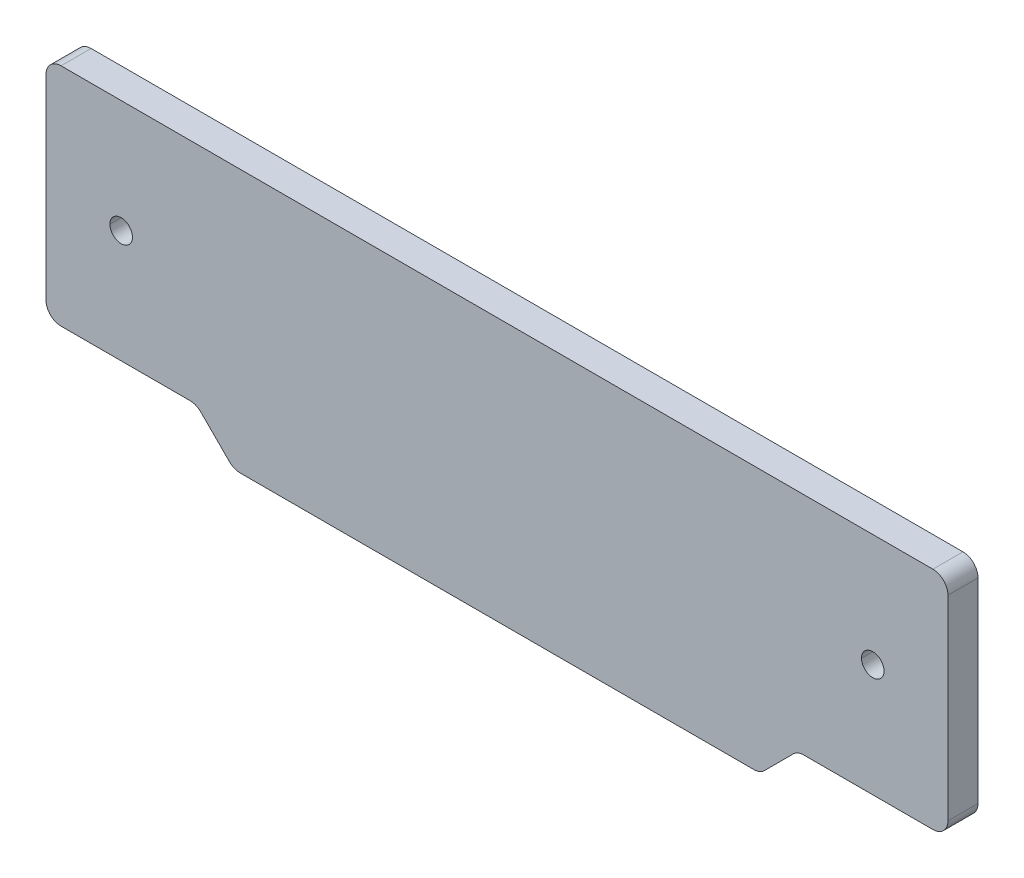
ISO-10303-21;
HEADER;
FILE_DESCRIPTION(('STEP AP214'),'2;1');
FILE_NAME('part.step','',(''),(''),'','','');
FILE_SCHEMA(('AUTOMOTIVE_DESIGN { 1 0 10303 214 1 1 1 1 }'));
ENDSEC;
DATA;
#1=APPLICATION_CONTEXT('core data for automotive mechanical design processes');
#2=APPLICATION_PROTOCOL_DEFINITION('international standard','automotive_design',2000,#1);
#3=PRODUCT_CONTEXT('',#1,'mechanical');
#4=PRODUCT('Part','Part','',(#3));
#5=PRODUCT_RELATED_PRODUCT_CATEGORY('part','',(#4));
#6=PRODUCT_DEFINITION_FORMATION('','',#4);
#7=PRODUCT_DEFINITION_CONTEXT('part definition',#1,'design');
#8=PRODUCT_DEFINITION('design','',#6,#7);
#9=PRODUCT_DEFINITION_SHAPE('','',#8);
#10=(LENGTH_UNIT() NAMED_UNIT(*) SI_UNIT(.MILLI.,.METRE.));
#11=(NAMED_UNIT(*) PLANE_ANGLE_UNIT() SI_UNIT($,.RADIAN.));
#12=(NAMED_UNIT(*) SI_UNIT($,.STERADIAN.) SOLID_ANGLE_UNIT());
#13=UNCERTAINTY_MEASURE_WITH_UNIT(LENGTH_MEASURE(1.E-05),#10,'distance_accuracy_value','');
#14=(GEOMETRIC_REPRESENTATION_CONTEXT(3) GLOBAL_UNCERTAINTY_ASSIGNED_CONTEXT((#13)) GLOBAL_UNIT_ASSIGNED_CONTEXT((#10,
#11,#12)) REPRESENTATION_CONTEXT('',''));
#15=CARTESIAN_POINT('',(0.,0.,0.));
#16=DIRECTION('',(0.,0.,1.));
#17=DIRECTION('',(1.,0.,0.));
#18=AXIS2_PLACEMENT_3D('',#15,#16,#17);
#19=CARTESIAN_POINT('',(34.1715728752538,-16.5010003298521,-1.97999998554587));
#20=DIRECTION('',(0.,0.,1.));
#21=DIRECTION('',(1.,0.,0.));
#22=AXIS2_PLACEMENT_3D('',#19,#20,#21);
#23=CYLINDRICAL_SURFACE('',#22,2.);
#24=CARTESIAN_POINT('',(34.1715728752538,-16.5010003298521,-1.97999998554587));
#25=DIRECTION('',(0.,0.,-1.));
#26=DIRECTION('',(1.,0.,0.));
#27=AXIS2_PLACEMENT_3D('',#24,#25,#26);
#28=CIRCLE('',#27,2.);
#29=CARTESIAN_POINT('',(35.5857864376269,-17.9152138922252,-1.97999998554587));
#30=VERTEX_POINT('',#29);
#31=CARTESIAN_POINT('',(34.1715728752538,-18.5010003298521,-1.97999998554587));
#32=VERTEX_POINT('',#31);
#33=EDGE_CURVE('E260',#30,#32,#28,.T.);
#34=ORIENTED_EDGE('',*,*,#33,.F.);
#35=DIRECTION('',(0.,0.,-1.));
#36=VECTOR('',#35,1.);
#37=CARTESIAN_POINT('',(35.5857864376269,-17.9152138922252,-1.97999998554587));
#38=LINE('',#37,#36);
#39=CARTESIAN_POINT('',(35.5857864376269,-17.9152138922252,2.02000001445413));
#40=VERTEX_POINT('',#39);
#41=EDGE_CURVE('E272',#40,#30,#38,.T.);
#42=ORIENTED_EDGE('',*,*,#41,.F.);
#43=CARTESIAN_POINT('',(34.1715728752538,-16.5010003298521,2.02000001445413));
#44=DIRECTION('',(0.,0.,1.));
#45=DIRECTION('',(1.,0.,0.));
#46=AXIS2_PLACEMENT_3D('',#43,#44,#45);
#47=CIRCLE('',#46,2.);
#48=CARTESIAN_POINT('',(34.1715728752538,-18.5010003298521,2.02000001445413));
#49=VERTEX_POINT('',#48);
#50=EDGE_CURVE('E276',#49,#40,#47,.T.);
#51=ORIENTED_EDGE('',*,*,#50,.F.);
#52=DIRECTION('',(0.,0.,1.));
#53=VECTOR('',#52,1.);
#54=CARTESIAN_POINT('',(34.1715728752538,-18.5010003298521,-1.97999998554587));
#55=LINE('',#54,#53);
#56=EDGE_CURVE('E214',#32,#49,#55,.T.);
#57=ORIENTED_EDGE('',*,*,#56,.F.);
#58=EDGE_LOOP('',(#34,#42,#51,#57));
#59=FACE_BOUND('',#58,.T.);
#60=ADVANCED_FACE('F15',(#59),#23,.T.);
#61=CARTESIAN_POINT('',(40.8284271247462,-15.5010003298521,-1.97999998554587));
#62=DIRECTION('',(0.,0.,-1.));
#63=DIRECTION('',(-1.,0.,0.));
#64=AXIS2_PLACEMENT_3D('',#61,#62,#63);
#65=CYLINDRICAL_SURFACE('',#64,2.);
#66=CARTESIAN_POINT('',(40.8284271247462,-15.5010003298521,-1.97999998554587));
#67=DIRECTION('',(0.,0.,1.));
#68=DIRECTION('',(1.,0.,0.));
#69=AXIS2_PLACEMENT_3D('',#66,#67,#68);
#70=CIRCLE('',#69,2.);
#71=CARTESIAN_POINT('',(40.8284271247462,-13.5010003298521,-1.97999998554587));
#72=VERTEX_POINT('',#71);
#73=CARTESIAN_POINT('',(39.4142135623731,-14.086786767479,-1.97999998554587));
#74=VERTEX_POINT('',#73);
#75=EDGE_CURVE('E257',#72,#74,#70,.T.);
#76=ORIENTED_EDGE('',*,*,#75,.F.);
#77=DIRECTION('',(0.,0.,-1.));
#78=VECTOR('',#77,1.);
#79=CARTESIAN_POINT('',(40.8284271247462,-13.5010003298521,-1.97999998554587));
#80=LINE('',#79,#78);
#81=CARTESIAN_POINT('',(40.8284271247462,-13.5010003298521,2.02000001445413));
#82=VERTEX_POINT('',#81);
#83=EDGE_CURVE('E248',#82,#72,#80,.T.);
#84=ORIENTED_EDGE('',*,*,#83,.F.);
#85=CARTESIAN_POINT('',(40.8284271247462,-15.5010003298521,2.02000001445413));
#86=DIRECTION('',(0.,0.,-1.));
#87=DIRECTION('',(1.,0.,0.));
#88=AXIS2_PLACEMENT_3D('',#85,#86,#87);
#89=CIRCLE('',#88,2.);
#90=CARTESIAN_POINT('',(39.4142135623731,-14.086786767479,2.02000001445413));
#91=VERTEX_POINT('',#90);
#92=EDGE_CURVE('E273',#91,#82,#89,.T.);
#93=ORIENTED_EDGE('',*,*,#92,.F.);
#94=DIRECTION('',(0.,0.,1.));
#95=VECTOR('',#94,1.);
#96=CARTESIAN_POINT('',(39.4142135623731,-14.086786767479,2.02000001445413));
#97=LINE('',#96,#95);
#98=EDGE_CURVE('E371',#74,#91,#97,.T.);
#99=ORIENTED_EDGE('',*,*,#98,.F.);
#100=EDGE_LOOP('',(#76,#84,#93,#99));
#101=FACE_BOUND('',#100,.T.);
#102=ADVANCED_FACE('F447',(#101),#65,.F.);
#103=CARTESIAN_POINT('',(-34.1715728752538,-16.5010003298521,-1.97999998554587));
#104=DIRECTION('',(0.,0.,1.));
#105=DIRECTION('',(1.,0.,0.));
#106=AXIS2_PLACEMENT_3D('',#103,#104,#105);
#107=CYLINDRICAL_SURFACE('',#106,2.);
#108=CARTESIAN_POINT('',(-34.1715728752538,-16.5010003298521,-1.97999998554587));
#109=DIRECTION('',(0.,0.,-1.));
#110=DIRECTION('',(1.,0.,0.));
#111=AXIS2_PLACEMENT_3D('',#108,#109,#110);
#112=CIRCLE('',#111,2.);
#113=CARTESIAN_POINT('',(-34.1715728752538,-18.5010003298521,-1.97999998554587));
#114=VERTEX_POINT('',#113);
#115=CARTESIAN_POINT('',(-35.5857864376269,-17.9152138922252,-1.97999998554587));
#116=VERTEX_POINT('',#115);
#117=EDGE_CURVE('E19',#114,#116,#112,.T.);
#118=ORIENTED_EDGE('',*,*,#117,.F.);
#119=DIRECTION('',(0.,0.,-1.));
#120=VECTOR('',#119,1.);
#121=CARTESIAN_POINT('',(-34.1715728752538,-18.5010003298521,-1.97999998554587));
#122=LINE('',#121,#120);
#123=CARTESIAN_POINT('',(-34.1715728752538,-18.5010003298521,2.02000001445413));
#124=VERTEX_POINT('',#123);
#125=EDGE_CURVE('E229',#124,#114,#122,.T.);
#126=ORIENTED_EDGE('',*,*,#125,.F.);
#127=CARTESIAN_POINT('',(-34.1715728752538,-16.5010003298521,2.02000001445413));
#128=DIRECTION('',(0.,0.,1.));
#129=DIRECTION('',(1.,0.,0.));
#130=AXIS2_PLACEMENT_3D('',#127,#128,#129);
#131=CIRCLE('',#130,2.);
#132=CARTESIAN_POINT('',(-35.5857864376269,-17.9152138922252,2.02000001445413));
#133=VERTEX_POINT('',#132);
#134=EDGE_CURVE('E196',#133,#124,#131,.T.);
#135=ORIENTED_EDGE('',*,*,#134,.F.);
#136=DIRECTION('',(0.,0.,1.));
#137=VECTOR('',#136,1.);
#138=CARTESIAN_POINT('',(-35.5857864376269,-17.9152138922252,-1.97999998554587));
#139=LINE('',#138,#137);
#140=EDGE_CURVE('E212',#116,#133,#139,.T.);
#141=ORIENTED_EDGE('',*,*,#140,.F.);
#142=EDGE_LOOP('',(#118,#126,#135,#141));
#143=FACE_BOUND('',#142,.T.);
#144=ADVANCED_FACE('F17',(#143),#107,.T.);
#145=CARTESIAN_POINT('',(-40.8284271247462,-15.5010003298521,-1.97999998554587));
#146=DIRECTION('',(0.,0.,-1.));
#147=DIRECTION('',(-1.,0.,0.));
#148=AXIS2_PLACEMENT_3D('',#145,#146,#147);
#149=CYLINDRICAL_SURFACE('',#148,2.);
#150=CARTESIAN_POINT('',(-40.8284271247462,-15.5010003298521,-1.97999998554587));
#151=DIRECTION('',(0.,0.,1.));
#152=DIRECTION('',(1.,0.,0.));
#153=AXIS2_PLACEMENT_3D('',#150,#151,#152);
#154=CIRCLE('',#153,2.);
#155=CARTESIAN_POINT('',(-39.4142135623731,-14.086786767479,-1.97999998554587));
#156=VERTEX_POINT('',#155);
#157=CARTESIAN_POINT('',(-40.8284271247462,-13.5010003298521,-1.97999998554587));
#158=VERTEX_POINT('',#157);
#159=EDGE_CURVE('E202',#156,#158,#154,.T.);
#160=ORIENTED_EDGE('',*,*,#159,.F.);
#161=DIRECTION('',(0.,0.,-1.));
#162=VECTOR('',#161,1.);
#163=CARTESIAN_POINT('',(-39.4142135623731,-14.086786767479,-1.97999998554587));
#164=LINE('',#163,#162);
#165=CARTESIAN_POINT('',(-39.4142135623731,-14.086786767479,2.02000001445413));
#166=VERTEX_POINT('',#165);
#167=EDGE_CURVE('E200',#166,#156,#164,.T.);
#168=ORIENTED_EDGE('',*,*,#167,.F.);
#169=CARTESIAN_POINT('',(-40.8284271247462,-15.5010003298521,2.02000001445413));
#170=DIRECTION('',(0.,0.,-1.));
#171=DIRECTION('',(1.,0.,0.));
#172=AXIS2_PLACEMENT_3D('',#169,#170,#171);
#173=CIRCLE('',#172,2.);
#174=CARTESIAN_POINT('',(-40.8284271247462,-13.5010003298521,2.02000001445413));
#175=VERTEX_POINT('',#174);
#176=EDGE_CURVE('E185',#175,#166,#173,.T.);
#177=ORIENTED_EDGE('',*,*,#176,.F.);
#178=DIRECTION('',(0.,0.,1.));
#179=VECTOR('',#178,1.);
#180=CARTESIAN_POINT('',(-40.8284271247462,-13.5010003298521,2.02000001445413));
#181=LINE('',#180,#179);
#182=EDGE_CURVE('E351',#158,#175,#181,.T.);
#183=ORIENTED_EDGE('',*,*,#182,.F.);
#184=EDGE_LOOP('',(#160,#168,#177,#183));
#185=FACE_BOUND('',#184,.T.);
#186=ADVANCED_FACE('F201',(#185),#149,.F.);
#187=CARTESIAN_POINT('',(58.,-11.5010003298521,-1.97999998554587));
#188=DIRECTION('',(0.,0.,1.));
#189=DIRECTION('',(1.,0.,0.));
#190=AXIS2_PLACEMENT_3D('',#187,#188,#189);
#191=CYLINDRICAL_SURFACE('',#190,2.);
#192=CARTESIAN_POINT('',(58.,-11.5010003298521,-1.97999998554587));
#193=DIRECTION('',(0.,0.,-1.));
#194=DIRECTION('',(1.,0.,0.));
#195=AXIS2_PLACEMENT_3D('',#192,#193,#194);
#196=CIRCLE('',#195,2.);
#197=CARTESIAN_POINT('',(60.,-11.5010003298521,-1.97999998554587));
#198=VERTEX_POINT('',#197);
#199=CARTESIAN_POINT('',(58.,-13.5010003298521,-1.97999998554587));
#200=VERTEX_POINT('',#199);
#201=EDGE_CURVE('E261',#198,#200,#196,.T.);
#202=ORIENTED_EDGE('',*,*,#201,.F.);
#203=DIRECTION('',(0.,0.,-1.));
#204=VECTOR('',#203,1.);
#205=CARTESIAN_POINT('',(60.,-11.5010003298521,-1.97999998554587));
#206=LINE('',#205,#204);
#207=CARTESIAN_POINT('',(60.,-11.5010003298521,2.02000001445413));
#208=VERTEX_POINT('',#207);
#209=EDGE_CURVE('E292',#208,#198,#206,.T.);
#210=ORIENTED_EDGE('',*,*,#209,.F.);
#211=CARTESIAN_POINT('',(58.,-11.5010003298521,2.02000001445413));
#212=DIRECTION('',(0.,0.,1.));
#213=DIRECTION('',(1.,0.,0.));
#214=AXIS2_PLACEMENT_3D('',#211,#212,#213);
#215=CIRCLE('',#214,2.);
#216=CARTESIAN_POINT('',(58.,-13.5010003298521,2.02000001445413));
#217=VERTEX_POINT('',#216);
#218=EDGE_CURVE('E41',#217,#208,#215,.T.);
#219=ORIENTED_EDGE('',*,*,#218,.F.);
#220=DIRECTION('',(0.,0.,1.));
#221=VECTOR('',#220,1.);
#222=CARTESIAN_POINT('',(58.,-13.5010003298521,-1.97999998554587));
#223=LINE('',#222,#221);
#224=EDGE_CURVE('E249',#200,#217,#223,.T.);
#225=ORIENTED_EDGE('',*,*,#224,.F.);
#226=EDGE_LOOP('',(#202,#210,#219,#225));
#227=FACE_BOUND('',#226,.T.);
#228=ADVANCED_FACE('F464',(#227),#191,.T.);
#229=CARTESIAN_POINT('',(-58.,-11.5010003298521,-1.97999998554587));
#230=DIRECTION('',(0.,0.,1.));
#231=DIRECTION('',(1.,0.,0.));
#232=AXIS2_PLACEMENT_3D('',#229,#230,#231);
#233=CYLINDRICAL_SURFACE('',#232,2.);
#234=CARTESIAN_POINT('',(-58.,-11.5010003298521,-1.97999998554587));
#235=DIRECTION('',(0.,0.,-1.));
#236=DIRECTION('',(1.,0.,0.));
#237=AXIS2_PLACEMENT_3D('',#234,#235,#236);
#238=CIRCLE('',#237,2.);
#239=CARTESIAN_POINT('',(-58.,-13.5010003298521,-1.97999998554587));
#240=VERTEX_POINT('',#239);
#241=CARTESIAN_POINT('',(-60.,-11.5010003298521,-1.97999998554587));
#242=VERTEX_POINT('',#241);
#243=EDGE_CURVE('E225',#240,#242,#238,.T.);
#244=ORIENTED_EDGE('',*,*,#243,.F.);
#245=DIRECTION('',(0.,0.,-1.));
#246=VECTOR('',#245,1.);
#247=CARTESIAN_POINT('',(-58.,-13.5010003298521,-1.97999998554587));
#248=LINE('',#247,#246);
#249=CARTESIAN_POINT('',(-58.,-13.5010003298521,2.02000001445413));
#250=VERTEX_POINT('',#249);
#251=EDGE_CURVE('E234',#250,#240,#248,.T.);
#252=ORIENTED_EDGE('',*,*,#251,.F.);
#253=CARTESIAN_POINT('',(-58.,-11.5010003298521,2.02000001445413));
#254=DIRECTION('',(0.,0.,1.));
#255=DIRECTION('',(1.,0.,0.));
#256=AXIS2_PLACEMENT_3D('',#253,#254,#255);
#257=CIRCLE('',#256,2.);
#258=CARTESIAN_POINT('',(-60.,-11.5010003298521,2.02000001445413));
#259=VERTEX_POINT('',#258);
#260=EDGE_CURVE('E197',#259,#250,#257,.T.);
#261=ORIENTED_EDGE('',*,*,#260,.F.);
#262=DIRECTION('',(0.,0.,1.));
#263=VECTOR('',#262,1.);
#264=CARTESIAN_POINT('',(-60.,-11.5010003298521,-1.97999998554587));
#265=LINE('',#264,#263);
#266=EDGE_CURVE('E244',#242,#259,#265,.T.);
#267=ORIENTED_EDGE('',*,*,#266,.F.);
#268=EDGE_LOOP('',(#244,#252,#261,#267));
#269=FACE_BOUND('',#268,.T.);
#270=ADVANCED_FACE('F475',(#269),#233,.T.);
#271=CARTESIAN_POINT('',(-58.,14.4989996701479,-1.97999998554587));
#272=DIRECTION('',(0.,0.,1.));
#273=DIRECTION('',(1.,0.,0.));
#274=AXIS2_PLACEMENT_3D('',#271,#272,#273);
#275=CYLINDRICAL_SURFACE('',#274,2.);
#276=CARTESIAN_POINT('',(-58.,14.4989996701479,-1.97999998554587));
#277=DIRECTION('',(0.,0.,-1.));
#278=DIRECTION('',(1.,0.,0.));
#279=AXIS2_PLACEMENT_3D('',#276,#277,#278);
#280=CIRCLE('',#279,2.);
#281=CARTESIAN_POINT('',(-60.,14.4989996701479,-1.97999998554587));
#282=VERTEX_POINT('',#281);
#283=CARTESIAN_POINT('',(-58.,16.4989996701479,-1.97999998554587));
#284=VERTEX_POINT('',#283);
#285=EDGE_CURVE('E253',#282,#284,#280,.T.);
#286=ORIENTED_EDGE('',*,*,#285,.F.);
#287=DIRECTION('',(0.,0.,-1.));
#288=VECTOR('',#287,1.);
#289=CARTESIAN_POINT('',(-60.,14.4989996701479,-1.97999998554587));
#290=LINE('',#289,#288);
#291=CARTESIAN_POINT('',(-60.,14.4989996701479,2.02000001445413));
#292=VERTEX_POINT('',#291);
#293=EDGE_CURVE('E360',#292,#282,#290,.T.);
#294=ORIENTED_EDGE('',*,*,#293,.F.);
#295=CARTESIAN_POINT('',(-58.,14.4989996701479,2.02000001445413));
#296=DIRECTION('',(0.,0.,1.));
#297=DIRECTION('',(1.,0.,0.));
#298=AXIS2_PLACEMENT_3D('',#295,#296,#297);
#299=CIRCLE('',#298,2.);
#300=CARTESIAN_POINT('',(-58.,16.4989996701479,2.02000001445413));
#301=VERTEX_POINT('',#300);
#302=EDGE_CURVE('E267',#301,#292,#299,.T.);
#303=ORIENTED_EDGE('',*,*,#302,.F.);
#304=DIRECTION('',(0.,0.,1.));
#305=VECTOR('',#304,1.);
#306=CARTESIAN_POINT('',(-58.,16.4989996701479,-1.97999998554587));
#307=LINE('',#306,#305);
#308=EDGE_CURVE('E326',#284,#301,#307,.T.);
#309=ORIENTED_EDGE('',*,*,#308,.F.);
#310=EDGE_LOOP('',(#286,#294,#303,#309));
#311=FACE_BOUND('',#310,.T.);
#312=ADVANCED_FACE('F457',(#311),#275,.T.);
#313=CARTESIAN_POINT('',(58.,14.4989996701479,-1.97999998554587));
#314=DIRECTION('',(0.,0.,1.));
#315=DIRECTION('',(1.,0.,0.));
#316=AXIS2_PLACEMENT_3D('',#313,#314,#315);
#317=CYLINDRICAL_SURFACE('',#316,2.);
#318=CARTESIAN_POINT('',(58.,14.4989996701479,-1.97999998554587));
#319=DIRECTION('',(0.,0.,-1.));
#320=DIRECTION('',(1.,0.,0.));
#321=AXIS2_PLACEMENT_3D('',#318,#319,#320);
#322=CIRCLE('',#321,2.);
#323=CARTESIAN_POINT('',(58.,16.4989996701479,-1.97999998554587));
#324=VERTEX_POINT('',#323);
#325=CARTESIAN_POINT('',(60.,14.4989996701479,-1.97999998554587));
#326=VERTEX_POINT('',#325);
#327=EDGE_CURVE('E296',#324,#326,#322,.T.);
#328=ORIENTED_EDGE('',*,*,#327,.F.);
#329=DIRECTION('',(0.,0.,-1.));
#330=VECTOR('',#329,1.);
#331=CARTESIAN_POINT('',(58.,16.4989996701479,-1.97999998554587));
#332=LINE('',#331,#330);
#333=CARTESIAN_POINT('',(58.,16.4989996701479,2.02000001445413));
#334=VERTEX_POINT('',#333);
#335=EDGE_CURVE('E243',#334,#324,#332,.T.);
#336=ORIENTED_EDGE('',*,*,#335,.F.);
#337=CARTESIAN_POINT('',(58.,14.4989996701479,2.02000001445413));
#338=DIRECTION('',(0.,0.,1.));
#339=DIRECTION('',(1.,0.,0.));
#340=AXIS2_PLACEMENT_3D('',#337,#338,#339);
#341=CIRCLE('',#340,2.);
#342=CARTESIAN_POINT('',(60.,14.4989996701479,2.02000001445413));
#343=VERTEX_POINT('',#342);
#344=EDGE_CURVE('E265',#343,#334,#341,.T.);
#345=ORIENTED_EDGE('',*,*,#344,.F.);
#346=DIRECTION('',(0.,0.,1.));
#347=VECTOR('',#346,1.);
#348=CARTESIAN_POINT('',(60.,14.4989996701479,-1.97999998554587));
#349=LINE('',#348,#347);
#350=EDGE_CURVE('E325',#326,#343,#349,.T.);
#351=ORIENTED_EDGE('',*,*,#350,.F.);
#352=EDGE_LOOP('',(#328,#336,#345,#351));
#353=FACE_BOUND('',#352,.T.);
#354=ADVANCED_FACE('F458',(#353),#317,.T.);
#355=CARTESIAN_POINT('',(50.,1.49899967014788,-1.97999998554587));
#356=DIRECTION('',(0.,0.,1.));
#357=DIRECTION('',(1.,0.,0.));
#358=AXIS2_PLACEMENT_3D('',#355,#356,#357);
#359=CYLINDRICAL_SURFACE('',#358,1.5);
#360=DIRECTION('',(0.,0.,1.));
#361=VECTOR('',#360,1.);
#362=CARTESIAN_POINT('',(48.5,1.49899967014788,-1.97999998554587));
#363=LINE('',#362,#361);
#364=CARTESIAN_POINT('',(48.5,1.49899967014788,-1.97999998554587));
#365=VERTEX_POINT('',#364);
#366=CARTESIAN_POINT('',(48.5,1.49899967014788,2.02000001445413));
#367=VERTEX_POINT('',#366);
#368=EDGE_CURVE('E321',#365,#367,#363,.T.);
#369=ORIENTED_EDGE('',*,*,#368,.F.);
#370=CARTESIAN_POINT('',(50.,1.49899967014788,-1.97999998554587));
#371=DIRECTION('',(0.,0.,1.));
#372=DIRECTION('',(1.,0.,0.));
#373=AXIS2_PLACEMENT_3D('',#370,#371,#372);
#374=CIRCLE('',#373,1.5);
#375=CARTESIAN_POINT('',(51.5,1.49899967014788,-1.97999998554587));
#376=VERTEX_POINT('',#375);
#377=EDGE_CURVE('E256',#376,#365,#374,.T.);
#378=ORIENTED_EDGE('',*,*,#377,.F.);
#379=DIRECTION('',(0.,0.,1.));
#380=VECTOR('',#379,1.);
#381=CARTESIAN_POINT('',(51.5,1.49899967014788,-1.97999998554587));
#382=LINE('',#381,#380);
#383=CARTESIAN_POINT('',(51.5,1.49899967014788,2.02000001445413));
#384=VERTEX_POINT('',#383);
#385=EDGE_CURVE('E314',#376,#384,#382,.T.);
#386=ORIENTED_EDGE('',*,*,#385,.T.);
#387=CARTESIAN_POINT('',(50.,1.49899967014788,2.02000001445413));
#388=DIRECTION('',(0.,0.,1.));
#389=DIRECTION('',(1.,0.,0.));
#390=AXIS2_PLACEMENT_3D('',#387,#388,#389);
#391=CIRCLE('',#390,1.5);
#392=EDGE_CURVE('E26',#384,#367,#391,.T.);
#393=ORIENTED_EDGE('',*,*,#392,.T.);
#394=EDGE_LOOP('',(#369,#378,#386,#393));
#395=FACE_BOUND('',#394,.T.);
#396=ADVANCED_FACE('F425',(#395),#359,.F.);
#397=CARTESIAN_POINT('',(-50.,1.49899967014788,-1.97999998554587));
#398=DIRECTION('',(0.,0.,1.));
#399=DIRECTION('',(1.,0.,0.));
#400=AXIS2_PLACEMENT_3D('',#397,#398,#399);
#401=CYLINDRICAL_SURFACE('',#400,1.5);
#402=DIRECTION('',(0.,0.,1.));
#403=VECTOR('',#402,1.);
#404=CARTESIAN_POINT('',(-51.5,1.49899967014788,-1.97999998554587));
#405=LINE('',#404,#403);
#406=CARTESIAN_POINT('',(-51.5,1.49899967014788,-1.97999998554587));
#407=VERTEX_POINT('',#406);
#408=CARTESIAN_POINT('',(-51.5,1.49899967014788,2.02000001445413));
#409=VERTEX_POINT('',#408);
#410=EDGE_CURVE('E303',#407,#409,#405,.T.);
#411=ORIENTED_EDGE('',*,*,#410,.F.);
#412=CARTESIAN_POINT('',(-50.,1.49899967014788,-1.97999998554587));
#413=DIRECTION('',(0.,0.,1.));
#414=DIRECTION('',(1.,0.,0.));
#415=AXIS2_PLACEMENT_3D('',#412,#413,#414);
#416=CIRCLE('',#415,1.5);
#417=CARTESIAN_POINT('',(-48.5,1.49899967014788,-1.97999998554587));
#418=VERTEX_POINT('',#417);
#419=EDGE_CURVE('E262',#418,#407,#416,.T.);
#420=ORIENTED_EDGE('',*,*,#419,.F.);
#421=DIRECTION('',(0.,0.,1.));
#422=VECTOR('',#421,1.);
#423=CARTESIAN_POINT('',(-48.5,1.49899967014788,-1.97999998554587));
#424=LINE('',#423,#422);
#425=CARTESIAN_POINT('',(-48.5,1.49899967014788,2.02000001445413));
#426=VERTEX_POINT('',#425);
#427=EDGE_CURVE('E291',#418,#426,#424,.T.);
#428=ORIENTED_EDGE('',*,*,#427,.T.);
#429=CARTESIAN_POINT('',(-50.,1.49899967014788,2.02000001445413));
#430=DIRECTION('',(0.,0.,1.));
#431=DIRECTION('',(1.,0.,0.));
#432=AXIS2_PLACEMENT_3D('',#429,#430,#431);
#433=CIRCLE('',#432,1.5);
#434=EDGE_CURVE('E10',#426,#409,#433,.T.);
#435=ORIENTED_EDGE('',*,*,#434,.T.);
#436=EDGE_LOOP('',(#411,#420,#428,#435));
#437=FACE_BOUND('',#436,.T.);
#438=ADVANCED_FACE('F431',(#437),#401,.F.);
#439=CARTESIAN_POINT('',(0.,0.,2.02000001445413));
#440=DIRECTION('',(0.,0.,1.));
#441=DIRECTION('',(1.,0.,0.));
#442=AXIS2_PLACEMENT_3D('',#439,#440,#441);
#443=PLANE('',#442);
#444=ORIENTED_EDGE('',*,*,#434,.F.);
#445=CARTESIAN_POINT('',(-50.,1.49899967014788,2.02000001445413));
#446=DIRECTION('',(0.,0.,1.));
#447=DIRECTION('',(1.,0.,0.));
#448=AXIS2_PLACEMENT_3D('',#445,#446,#447);
#449=CIRCLE('',#448,1.5);
#450=EDGE_CURVE('E307',#409,#426,#449,.T.);
#451=ORIENTED_EDGE('',*,*,#450,.F.);
#452=EDGE_LOOP('',(#444,#451));
#453=FACE_BOUND('',#452,.T.);
#454=ORIENTED_EDGE('',*,*,#392,.F.);
#455=CARTESIAN_POINT('',(50.,1.49899967014788,2.02000001445413));
#456=DIRECTION('',(0.,0.,1.));
#457=DIRECTION('',(1.,0.,0.));
#458=AXIS2_PLACEMENT_3D('',#455,#456,#457);
#459=CIRCLE('',#458,1.5);
#460=EDGE_CURVE('E389',#367,#384,#459,.T.);
#461=ORIENTED_EDGE('',*,*,#460,.F.);
#462=EDGE_LOOP('',(#454,#461));
#463=FACE_BOUND('',#462,.T.);
#464=DIRECTION('',(0.,1.,0.));
#465=VECTOR('',#464,1.);
#466=CARTESIAN_POINT('',(60.,16.4989996701479,2.02000001445413));
#467=LINE('',#466,#465);
#468=EDGE_CURVE('E297',#208,#343,#467,.T.);
#469=ORIENTED_EDGE('',*,*,#468,.T.);
#470=ORIENTED_EDGE('',*,*,#344,.T.);
#471=DIRECTION('',(-1.,0.,0.));
#472=VECTOR('',#471,1.);
#473=CARTESIAN_POINT('',(-60.,16.4989996701479,2.02000001445413));
#474=LINE('',#473,#472);
#475=EDGE_CURVE('E239',#334,#301,#474,.T.);
#476=ORIENTED_EDGE('',*,*,#475,.T.);
#477=ORIENTED_EDGE('',*,*,#302,.T.);
#478=DIRECTION('',(0.,-1.,0.));
#479=VECTOR('',#478,1.);
#480=CARTESIAN_POINT('',(-60.,16.4989996701479,2.02000001445413));
#481=LINE('',#480,#479);
#482=EDGE_CURVE('E356',#292,#259,#481,.T.);
#483=ORIENTED_EDGE('',*,*,#482,.T.);
#484=ORIENTED_EDGE('',*,*,#260,.T.);
#485=DIRECTION('',(1.,0.,0.));
#486=VECTOR('',#485,1.);
#487=CARTESIAN_POINT('',(-60.,-13.5010003298521,2.02000001445413));
#488=LINE('',#487,#486);
#489=EDGE_CURVE('E191',#250,#175,#488,.T.);
#490=ORIENTED_EDGE('',*,*,#489,.T.);
#491=ORIENTED_EDGE('',*,*,#176,.T.);
#492=DIRECTION('',(0.707106781186545,-0.70710678118655,0.));
#493=VECTOR('',#492,1.);
#494=CARTESIAN_POINT('',(-35.,-18.5010003298521,2.02000001445413));
#495=LINE('',#494,#493);
#496=EDGE_CURVE('E189',#166,#133,#495,.T.);
#497=ORIENTED_EDGE('',*,*,#496,.T.);
#498=ORIENTED_EDGE('',*,*,#134,.T.);
#499=DIRECTION('',(1.,0.,0.));
#500=VECTOR('',#499,1.);
#501=CARTESIAN_POINT('',(35.,-18.5010003298521,2.02000001445413));
#502=LINE('',#501,#500);
#503=EDGE_CURVE('E233',#124,#49,#502,.T.);
#504=ORIENTED_EDGE('',*,*,#503,.T.);
#505=ORIENTED_EDGE('',*,*,#50,.T.);
#506=DIRECTION('',(0.707106781186545,0.70710678118655,0.));
#507=VECTOR('',#506,1.);
#508=CARTESIAN_POINT('',(40.,-13.5010003298521,2.02000001445413));
#509=LINE('',#508,#507);
#510=EDGE_CURVE('E286',#40,#91,#509,.T.);
#511=ORIENTED_EDGE('',*,*,#510,.T.);
#512=ORIENTED_EDGE('',*,*,#92,.T.);
#513=DIRECTION('',(1.,0.,0.));
#514=VECTOR('',#513,1.);
#515=CARTESIAN_POINT('',(60.,-13.5010003298521,2.02000001445413));
#516=LINE('',#515,#514);
#517=EDGE_CURVE('E245',#82,#217,#516,.T.);
#518=ORIENTED_EDGE('',*,*,#517,.T.);
#519=ORIENTED_EDGE('',*,*,#218,.T.);
#520=EDGE_LOOP('',(#469,#470,#476,#477,#483,#484,#490,#491,#497,#498,#504,#505,#511,#512,#518,#519));
#521=FACE_BOUND('',#520,.T.);
#522=ADVANCED_FACE('F187',(#453,#463,#521),#443,.T.);
#523=CARTESIAN_POINT('',(0.,0.,-1.97999998554587));
#524=DIRECTION('',(0.,0.,1.));
#525=DIRECTION('',(1.,0.,0.));
#526=AXIS2_PLACEMENT_3D('',#523,#524,#525);
#527=PLANE('',#526);
#528=ORIENTED_EDGE('',*,*,#419,.T.);
#529=CARTESIAN_POINT('',(-50.,1.49899967014788,-1.97999998554587));
#530=DIRECTION('',(0.,0.,1.));
#531=DIRECTION('',(1.,0.,0.));
#532=AXIS2_PLACEMENT_3D('',#529,#530,#531);
#533=CIRCLE('',#532,1.5);
#534=EDGE_CURVE('E308',#407,#418,#533,.T.);
#535=ORIENTED_EDGE('',*,*,#534,.T.);
#536=EDGE_LOOP('',(#528,#535));
#537=FACE_BOUND('',#536,.T.);
#538=ORIENTED_EDGE('',*,*,#377,.T.);
#539=CARTESIAN_POINT('',(50.,1.49899967014788,-1.97999998554587));
#540=DIRECTION('',(0.,0.,1.));
#541=DIRECTION('',(1.,0.,0.));
#542=AXIS2_PLACEMENT_3D('',#539,#540,#541);
#543=CIRCLE('',#542,1.5);
#544=EDGE_CURVE('E318',#365,#376,#543,.T.);
#545=ORIENTED_EDGE('',*,*,#544,.T.);
#546=EDGE_LOOP('',(#538,#545));
#547=FACE_BOUND('',#546,.T.);
#548=DIRECTION('',(-1.,0.,0.));
#549=VECTOR('',#548,1.);
#550=CARTESIAN_POINT('',(-60.,16.4989996701479,-1.97999998554587));
#551=LINE('',#550,#549);
#552=EDGE_CURVE('E336',#324,#284,#551,.T.);
#553=ORIENTED_EDGE('',*,*,#552,.F.);
#554=ORIENTED_EDGE('',*,*,#327,.T.);
#555=DIRECTION('',(0.,1.,0.));
#556=VECTOR('',#555,1.);
#557=CARTESIAN_POINT('',(60.,16.4989996701479,-1.97999998554587));
#558=LINE('',#557,#556);
#559=EDGE_CURVE('E322',#198,#326,#558,.T.);
#560=ORIENTED_EDGE('',*,*,#559,.F.);
#561=ORIENTED_EDGE('',*,*,#201,.T.);
#562=DIRECTION('',(1.,0.,0.));
#563=VECTOR('',#562,1.);
#564=CARTESIAN_POINT('',(60.,-13.5010003298521,-1.97999998554587));
#565=LINE('',#564,#563);
#566=EDGE_CURVE('E287',#72,#200,#565,.T.);
#567=ORIENTED_EDGE('',*,*,#566,.F.);
#568=ORIENTED_EDGE('',*,*,#75,.T.);
#569=DIRECTION('',(0.707106781186545,0.70710678118655,0.));
#570=VECTOR('',#569,1.);
#571=CARTESIAN_POINT('',(40.,-13.5010003298521,-1.97999998554587));
#572=LINE('',#571,#570);
#573=EDGE_CURVE('E282',#30,#74,#572,.T.);
#574=ORIENTED_EDGE('',*,*,#573,.F.);
#575=ORIENTED_EDGE('',*,*,#33,.T.);
#576=DIRECTION('',(1.,0.,0.));
#577=VECTOR('',#576,1.);
#578=CARTESIAN_POINT('',(35.,-18.5010003298521,-1.97999998554587));
#579=LINE('',#578,#577);
#580=EDGE_CURVE('E221',#114,#32,#579,.T.);
#581=ORIENTED_EDGE('',*,*,#580,.F.);
#582=ORIENTED_EDGE('',*,*,#117,.T.);
#583=DIRECTION('',(0.707106781186545,-0.70710678118655,0.));
#584=VECTOR('',#583,1.);
#585=CARTESIAN_POINT('',(-35.,-18.5010003298521,-1.97999998554587));
#586=LINE('',#585,#584);
#587=EDGE_CURVE('E207',#156,#116,#586,.T.);
#588=ORIENTED_EDGE('',*,*,#587,.F.);
#589=ORIENTED_EDGE('',*,*,#159,.T.);
#590=DIRECTION('',(1.,0.,0.));
#591=VECTOR('',#590,1.);
#592=CARTESIAN_POINT('',(-60.,-13.5010003298521,-1.97999998554587));
#593=LINE('',#592,#591);
#594=EDGE_CURVE('E238',#240,#158,#593,.T.);
#595=ORIENTED_EDGE('',*,*,#594,.F.);
#596=ORIENTED_EDGE('',*,*,#243,.T.);
#597=DIRECTION('',(0.,-1.,0.));
#598=VECTOR('',#597,1.);
#599=CARTESIAN_POINT('',(-60.,16.4989996701479,-1.97999998554587));
#600=LINE('',#599,#598);
#601=EDGE_CURVE('E368',#282,#242,#600,.T.);
#602=ORIENTED_EDGE('',*,*,#601,.F.);
#603=ORIENTED_EDGE('',*,*,#285,.T.);
#604=EDGE_LOOP('',(#553,#554,#560,#561,#567,#568,#574,#575,#581,#582,#588,#589,#595,#596,#602,#603));
#605=FACE_BOUND('',#604,.T.);
#606=ADVANCED_FACE('F430',(#537,#547,#605),#527,.F.);
#607=CARTESIAN_POINT('',(60.,16.4989996701479,-1.97999998554587));
#608=DIRECTION('',(1.,0.,0.));
#609=DIRECTION('',(0.,1.,0.));
#610=AXIS2_PLACEMENT_3D('',#607,#608,#609);
#611=PLANE('',#610);
#612=ORIENTED_EDGE('',*,*,#559,.T.);
#613=ORIENTED_EDGE('',*,*,#350,.T.);
#614=ORIENTED_EDGE('',*,*,#468,.F.);
#615=ORIENTED_EDGE('',*,*,#209,.T.);
#616=EDGE_LOOP('',(#612,#613,#614,#615));
#617=FACE_BOUND('',#616,.T.);
#618=ADVANCED_FACE('F439',(#617),#611,.T.);
#619=CARTESIAN_POINT('',(-60.,16.4989996701479,-1.97999998554587));
#620=DIRECTION('',(0.,1.,0.));
#621=DIRECTION('',(1.,0.,0.));
#622=AXIS2_PLACEMENT_3D('',#619,#620,#621);
#623=PLANE('',#622);
#624=ORIENTED_EDGE('',*,*,#475,.F.);
#625=ORIENTED_EDGE('',*,*,#335,.T.);
#626=ORIENTED_EDGE('',*,*,#552,.T.);
#627=ORIENTED_EDGE('',*,*,#308,.T.);
#628=EDGE_LOOP('',(#624,#625,#626,#627));
#629=FACE_BOUND('',#628,.T.);
#630=ADVANCED_FACE('F465',(#629),#623,.T.);
#631=CARTESIAN_POINT('',(-60.,16.4989996701479,-1.97999998554587));
#632=DIRECTION('',(-1.,0.,0.));
#633=DIRECTION('',(0.,1.,0.));
#634=AXIS2_PLACEMENT_3D('',#631,#632,#633);
#635=PLANE('',#634);
#636=ORIENTED_EDGE('',*,*,#482,.F.);
#637=ORIENTED_EDGE('',*,*,#293,.T.);
#638=ORIENTED_EDGE('',*,*,#601,.T.);
#639=ORIENTED_EDGE('',*,*,#266,.T.);
#640=EDGE_LOOP('',(#636,#637,#638,#639));
#641=FACE_BOUND('',#640,.T.);
#642=ADVANCED_FACE('F468',(#641),#635,.T.);
#643=CARTESIAN_POINT('',(-60.,-13.5010003298521,-1.97999998554587));
#644=DIRECTION('',(0.,-1.,0.));
#645=DIRECTION('',(0.,0.,-1.));
#646=AXIS2_PLACEMENT_3D('',#643,#644,#645);
#647=PLANE('',#646);
#648=ORIENTED_EDGE('',*,*,#489,.F.);
#649=ORIENTED_EDGE('',*,*,#251,.T.);
#650=ORIENTED_EDGE('',*,*,#594,.T.);
#651=ORIENTED_EDGE('',*,*,#182,.T.);
#652=EDGE_LOOP('',(#648,#649,#650,#651));
#653=FACE_BOUND('',#652,.T.);
#654=ADVANCED_FACE('F489',(#653),#647,.T.);
#655=CARTESIAN_POINT('',(-35.,-18.5010003298521,-1.97999998554587));
#656=DIRECTION('',(-0.70710678118655,-0.707106781186545,0.));
#657=DIRECTION('',(-0.707106781186545,0.70710678118655,0.));
#658=AXIS2_PLACEMENT_3D('',#655,#656,#657);
#659=PLANE('',#658);
#660=ORIENTED_EDGE('',*,*,#496,.F.);
#661=ORIENTED_EDGE('',*,*,#167,.T.);
#662=ORIENTED_EDGE('',*,*,#587,.T.);
#663=ORIENTED_EDGE('',*,*,#140,.T.);
#664=EDGE_LOOP('',(#660,#661,#662,#663));
#665=FACE_BOUND('',#664,.T.);
#666=ADVANCED_FACE('F210',(#665),#659,.T.);
#667=CARTESIAN_POINT('',(35.,-18.5010003298521,-1.97999998554587));
#668=DIRECTION('',(0.,-1.,0.));
#669=DIRECTION('',(0.,0.,-1.));
#670=AXIS2_PLACEMENT_3D('',#667,#668,#669);
#671=PLANE('',#670);
#672=ORIENTED_EDGE('',*,*,#503,.F.);
#673=ORIENTED_EDGE('',*,*,#125,.T.);
#674=ORIENTED_EDGE('',*,*,#580,.T.);
#675=ORIENTED_EDGE('',*,*,#56,.T.);
#676=EDGE_LOOP('',(#672,#673,#674,#675));
#677=FACE_BOUND('',#676,.T.);
#678=ADVANCED_FACE('F479',(#677),#671,.T.);
#679=CARTESIAN_POINT('',(40.,-13.5010003298521,-1.97999998554587));
#680=DIRECTION('',(0.70710678118655,-0.707106781186545,0.));
#681=DIRECTION('',(0.,0.,-1.));
#682=AXIS2_PLACEMENT_3D('',#679,#680,#681);
#683=PLANE('',#682);
#684=ORIENTED_EDGE('',*,*,#573,.T.);
#685=ORIENTED_EDGE('',*,*,#98,.T.);
#686=ORIENTED_EDGE('',*,*,#510,.F.);
#687=ORIENTED_EDGE('',*,*,#41,.T.);
#688=EDGE_LOOP('',(#684,#685,#686,#687));
#689=FACE_BOUND('',#688,.T.);
#690=ADVANCED_FACE('F472',(#689),#683,.T.);
#691=CARTESIAN_POINT('',(60.,-13.5010003298521,-1.97999998554587));
#692=DIRECTION('',(0.,-1.,0.));
#693=DIRECTION('',(-1.,0.,0.));
#694=AXIS2_PLACEMENT_3D('',#691,#692,#693);
#695=PLANE('',#694);
#696=ORIENTED_EDGE('',*,*,#566,.T.);
#697=ORIENTED_EDGE('',*,*,#224,.T.);
#698=ORIENTED_EDGE('',*,*,#517,.F.);
#699=ORIENTED_EDGE('',*,*,#83,.T.);
#700=EDGE_LOOP('',(#696,#697,#698,#699));
#701=FACE_BOUND('',#700,.T.);
#702=ADVANCED_FACE('F469',(#701),#695,.T.);
#703=CARTESIAN_POINT('',(-50.,1.49899967014788,-1.97999998554587));
#704=DIRECTION('',(0.,0.,1.));
#705=DIRECTION('',(1.,0.,0.));
#706=AXIS2_PLACEMENT_3D('',#703,#704,#705);
#707=CYLINDRICAL_SURFACE('',#706,1.5);
#708=ORIENTED_EDGE('',*,*,#534,.F.);
#709=ORIENTED_EDGE('',*,*,#410,.T.);
#710=ORIENTED_EDGE('',*,*,#450,.T.);
#711=ORIENTED_EDGE('',*,*,#427,.F.);
#712=EDGE_LOOP('',(#708,#709,#710,#711));
#713=FACE_BOUND('',#712,.T.);
#714=ADVANCED_FACE('F471',(#713),#707,.F.);
#715=CARTESIAN_POINT('',(50.,1.49899967014788,-1.97999998554587));
#716=DIRECTION('',(0.,0.,1.));
#717=DIRECTION('',(1.,0.,0.));
#718=AXIS2_PLACEMENT_3D('',#715,#716,#717);
#719=CYLINDRICAL_SURFACE('',#718,1.5);
#720=ORIENTED_EDGE('',*,*,#544,.F.);
#721=ORIENTED_EDGE('',*,*,#368,.T.);
#722=ORIENTED_EDGE('',*,*,#460,.T.);
#723=ORIENTED_EDGE('',*,*,#385,.F.);
#724=EDGE_LOOP('',(#720,#721,#722,#723));
#725=FACE_BOUND('',#724,.T.);
#726=ADVANCED_FACE('F420',(#725),#719,.F.);
#727=CLOSED_SHELL('',(#60,#102,#144,#186,#228,#270,#312,#354,#396,#438,#522,#606,#618,#630,#642,
#654,#666,#678,#690,#702,#714,#726));
#728=MANIFOLD_SOLID_BREP('B1',#727);
#729=ADVANCED_BREP_SHAPE_REPRESENTATION('',(#18,#728),#14);
#730=SHAPE_DEFINITION_REPRESENTATION(#9,#729);
ENDSEC;
END-ISO-10303-21;
